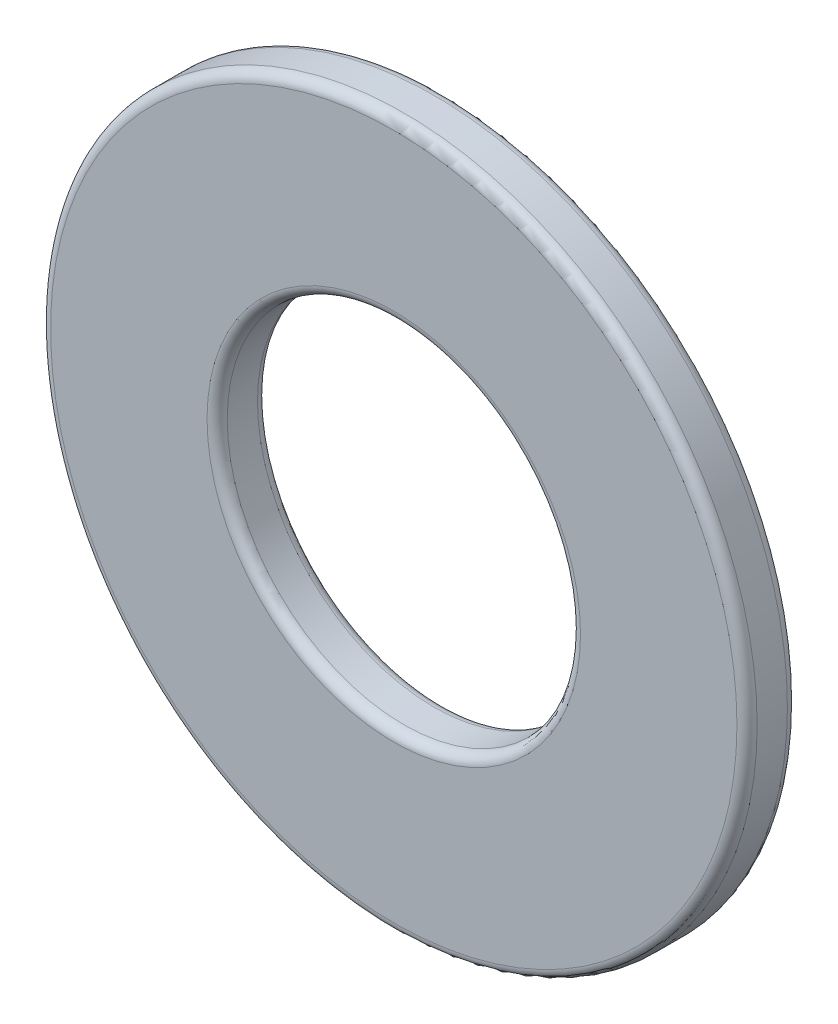
ISO-10303-21;
HEADER;
FILE_DESCRIPTION(('STEP AP214'),'2;1');
FILE_NAME('part.step','',(''),(''),'','','');
FILE_SCHEMA(('AUTOMOTIVE_DESIGN { 1 0 10303 214 1 1 1 1 }'));
ENDSEC;
DATA;
#1=APPLICATION_CONTEXT('core data for automotive mechanical design processes');
#2=APPLICATION_PROTOCOL_DEFINITION('international standard','automotive_design',2000,#1);
#3=PRODUCT_CONTEXT('',#1,'mechanical');
#4=PRODUCT('Part','Part','',(#3));
#5=PRODUCT_RELATED_PRODUCT_CATEGORY('part','',(#4));
#6=PRODUCT_DEFINITION_FORMATION('','',#4);
#7=PRODUCT_DEFINITION_CONTEXT('part definition',#1,'design');
#8=PRODUCT_DEFINITION('design','',#6,#7);
#9=PRODUCT_DEFINITION_SHAPE('','',#8);
#10=(LENGTH_UNIT() NAMED_UNIT(*) SI_UNIT(.MILLI.,.METRE.));
#11=(NAMED_UNIT(*) PLANE_ANGLE_UNIT() SI_UNIT($,.RADIAN.));
#12=(NAMED_UNIT(*) SI_UNIT($,.STERADIAN.) SOLID_ANGLE_UNIT());
#13=UNCERTAINTY_MEASURE_WITH_UNIT(LENGTH_MEASURE(1.E-05),#10,'distance_accuracy_value','');
#14=(GEOMETRIC_REPRESENTATION_CONTEXT(3) GLOBAL_UNCERTAINTY_ASSIGNED_CONTEXT((#13)) GLOBAL_UNIT_ASSIGNED_CONTEXT((#10,
#11,#12)) REPRESENTATION_CONTEXT('',''));
#15=CARTESIAN_POINT('',(0.,0.,0.));
#16=DIRECTION('',(0.,0.,1.));
#17=DIRECTION('',(1.,0.,0.));
#18=AXIS2_PLACEMENT_3D('',#15,#16,#17);
#19=CARTESIAN_POINT('',(0.,0.,1.));
#20=DIRECTION('',(0.,0.,1.));
#21=DIRECTION('',(1.,0.,0.));
#22=AXIS2_PLACEMENT_3D('',#19,#20,#21);
#23=PLANE('',#22);
#24=CARTESIAN_POINT('',(0.,0.,1.));
#25=DIRECTION('',(0.,0.,1.));
#26=DIRECTION('',(1.,0.,0.));
#27=AXIS2_PLACEMENT_3D('',#24,#25,#26);
#28=CIRCLE('',#27,3.7);
#29=CARTESIAN_POINT('',(3.7,0.,1.));
#30=VERTEX_POINT('',#29);
#31=EDGE_CURVE('E53',#30,#30,#28,.F.);
#32=ORIENTED_EDGE('',*,*,#31,.T.);
#33=EDGE_LOOP('',(#32));
#34=FACE_BOUND('',#33,.T.);
#35=CARTESIAN_POINT('',(0.,0.,1.));
#36=DIRECTION('',(0.,0.,1.));
#37=DIRECTION('',(1.,0.,0.));
#38=AXIS2_PLACEMENT_3D('',#35,#36,#37);
#39=CIRCLE('',#38,6.8);
#40=CARTESIAN_POINT('',(6.8,0.,1.));
#41=VERTEX_POINT('',#40);
#42=EDGE_CURVE('E56',#41,#41,#39,.T.);
#43=ORIENTED_EDGE('',*,*,#42,.T.);
#44=EDGE_LOOP('',(#43));
#45=FACE_BOUND('',#44,.T.);
#46=ADVANCED_FACE('F30',(#34,#45),#23,.T.);
#47=CARTESIAN_POINT('',(0.,0.,0.));
#48=DIRECTION('',(0.,0.,1.));
#49=DIRECTION('',(1.,0.,0.));
#50=AXIS2_PLACEMENT_3D('',#47,#48,#49);
#51=PLANE('',#50);
#52=CARTESIAN_POINT('',(0.,0.,0.));
#53=DIRECTION('',(0.,0.,1.));
#54=DIRECTION('',(1.,0.,0.));
#55=AXIS2_PLACEMENT_3D('',#52,#53,#54);
#56=CIRCLE('',#55,3.7);
#57=CARTESIAN_POINT('',(3.7,0.,0.));
#58=VERTEX_POINT('',#57);
#59=EDGE_CURVE('E37',#58,#58,#56,.T.);
#60=ORIENTED_EDGE('',*,*,#59,.T.);
#61=EDGE_LOOP('',(#60));
#62=FACE_BOUND('',#61,.T.);
#63=CARTESIAN_POINT('',(0.,0.,0.));
#64=DIRECTION('',(0.,0.,1.));
#65=DIRECTION('',(1.,0.,0.));
#66=AXIS2_PLACEMENT_3D('',#63,#64,#65);
#67=CIRCLE('',#66,6.8);
#68=CARTESIAN_POINT('',(6.8,0.,0.));
#69=VERTEX_POINT('',#68);
#70=EDGE_CURVE('E41',#69,#69,#67,.F.);
#71=ORIENTED_EDGE('',*,*,#70,.T.);
#72=EDGE_LOOP('',(#71));
#73=FACE_BOUND('',#72,.T.);
#74=ADVANCED_FACE('F82',(#62,#73),#51,.F.);
#75=CARTESIAN_POINT('',(0.,0.,1.));
#76=DIRECTION('',(0.,0.,-1.));
#77=DIRECTION('',(-1.,0.,0.));
#78=AXIS2_PLACEMENT_3D('',#75,#76,#77);
#79=CYLINDRICAL_SURFACE('',#78,7.);
#80=CARTESIAN_POINT('',(0.,0.,0.2));
#81=DIRECTION('',(0.,0.,1.));
#82=DIRECTION('',(1.,0.,0.));
#83=AXIS2_PLACEMENT_3D('',#80,#81,#82);
#84=CIRCLE('',#83,7.);
#85=CARTESIAN_POINT('',(7.,0.,0.2));
#86=VERTEX_POINT('',#85);
#87=EDGE_CURVE('E45',#86,#86,#84,.T.);
#88=ORIENTED_EDGE('',*,*,#87,.T.);
#89=EDGE_LOOP('',(#88));
#90=FACE_BOUND('',#89,.T.);
#91=CARTESIAN_POINT('',(0.,0.,0.8));
#92=DIRECTION('',(0.,0.,1.));
#93=DIRECTION('',(1.,0.,0.));
#94=AXIS2_PLACEMENT_3D('',#91,#92,#93);
#95=CIRCLE('',#94,7.);
#96=CARTESIAN_POINT('',(7.,0.,0.8));
#97=VERTEX_POINT('',#96);
#98=EDGE_CURVE('E50',#97,#97,#95,.F.);
#99=ORIENTED_EDGE('',*,*,#98,.T.);
#100=EDGE_LOOP('',(#99));
#101=FACE_BOUND('',#100,.T.);
#102=ADVANCED_FACE('F77',(#90,#101),#79,.T.);
#103=CARTESIAN_POINT('',(0.,0.,1.));
#104=DIRECTION('',(0.,0.,-1.));
#105=DIRECTION('',(-1.,0.,0.));
#106=AXIS2_PLACEMENT_3D('',#103,#104,#105);
#107=CYLINDRICAL_SURFACE('',#106,3.5);
#108=CARTESIAN_POINT('',(0.,0.,0.2));
#109=DIRECTION('',(0.,0.,1.));
#110=DIRECTION('',(1.,0.,0.));
#111=AXIS2_PLACEMENT_3D('',#108,#109,#110);
#112=CIRCLE('',#111,3.5);
#113=CARTESIAN_POINT('',(3.5,0.,0.2));
#114=VERTEX_POINT('',#113);
#115=EDGE_CURVE('E10',#114,#114,#112,.F.);
#116=ORIENTED_EDGE('',*,*,#115,.T.);
#117=EDGE_LOOP('',(#116));
#118=FACE_BOUND('',#117,.T.);
#119=CARTESIAN_POINT('',(0.,0.,0.8));
#120=DIRECTION('',(0.,0.,1.));
#121=DIRECTION('',(1.,0.,0.));
#122=AXIS2_PLACEMENT_3D('',#119,#120,#121);
#123=CIRCLE('',#122,3.5);
#124=CARTESIAN_POINT('',(3.5,0.,0.8));
#125=VERTEX_POINT('',#124);
#126=EDGE_CURVE('E59',#125,#125,#123,.T.);
#127=ORIENTED_EDGE('',*,*,#126,.T.);
#128=EDGE_LOOP('',(#127));
#129=FACE_BOUND('',#128,.T.);
#130=ADVANCED_FACE('F63',(#118,#129),#107,.F.);
#131=CARTESIAN_POINT('',(0.,0.,0.8));
#132=DIRECTION('',(0.,0.,1.));
#133=DIRECTION('',(1.,0.,0.));
#134=AXIS2_PLACEMENT_3D('',#131,#132,#133);
#135=TOROIDAL_SURFACE('',#134,3.7,0.2);
#136=ORIENTED_EDGE('',*,*,#31,.F.);
#137=EDGE_LOOP('',(#136));
#138=FACE_BOUND('',#137,.T.);
#139=ORIENTED_EDGE('',*,*,#126,.F.);
#140=EDGE_LOOP('',(#139));
#141=FACE_BOUND('',#140,.T.);
#142=ADVANCED_FACE('F65',(#138,#141),#135,.T.);
#143=CARTESIAN_POINT('',(0.,0.,0.2));
#144=DIRECTION('',(0.,0.,1.));
#145=DIRECTION('',(1.,0.,0.));
#146=AXIS2_PLACEMENT_3D('',#143,#144,#145);
#147=TOROIDAL_SURFACE('',#146,6.8,0.2);
#148=ORIENTED_EDGE('',*,*,#70,.F.);
#149=EDGE_LOOP('',(#148));
#150=FACE_BOUND('',#149,.T.);
#151=ORIENTED_EDGE('',*,*,#87,.F.);
#152=EDGE_LOOP('',(#151));
#153=FACE_BOUND('',#152,.T.);
#154=ADVANCED_FACE('F67',(#150,#153),#147,.T.);
#155=CARTESIAN_POINT('',(0.,0.,0.8));
#156=DIRECTION('',(0.,0.,1.));
#157=DIRECTION('',(1.,0.,0.));
#158=AXIS2_PLACEMENT_3D('',#155,#156,#157);
#159=TOROIDAL_SURFACE('',#158,6.8,0.2);
#160=ORIENTED_EDGE('',*,*,#98,.F.);
#161=EDGE_LOOP('',(#160));
#162=FACE_BOUND('',#161,.T.);
#163=ORIENTED_EDGE('',*,*,#42,.F.);
#164=EDGE_LOOP('',(#163));
#165=FACE_BOUND('',#164,.T.);
#166=ADVANCED_FACE('F74',(#162,#165),#159,.T.);
#167=CARTESIAN_POINT('',(0.,0.,0.2));
#168=DIRECTION('',(0.,0.,1.));
#169=DIRECTION('',(1.,0.,0.));
#170=AXIS2_PLACEMENT_3D('',#167,#168,#169);
#171=TOROIDAL_SURFACE('',#170,3.7,0.2);
#172=ORIENTED_EDGE('',*,*,#115,.F.);
#173=EDGE_LOOP('',(#172));
#174=FACE_BOUND('',#173,.T.);
#175=ORIENTED_EDGE('',*,*,#59,.F.);
#176=EDGE_LOOP('',(#175));
#177=FACE_BOUND('',#176,.T.);
#178=ADVANCED_FACE('F32',(#174,#177),#171,.T.);
#179=CLOSED_SHELL('',(#46,#74,#102,#130,#142,#154,#166,#178));
#180=MANIFOLD_SOLID_BREP('B2',#179);
#181=ADVANCED_BREP_SHAPE_REPRESENTATION('',(#18,#180),#14);
#182=SHAPE_DEFINITION_REPRESENTATION(#9,#181);
ENDSEC;
END-ISO-10303-21;
